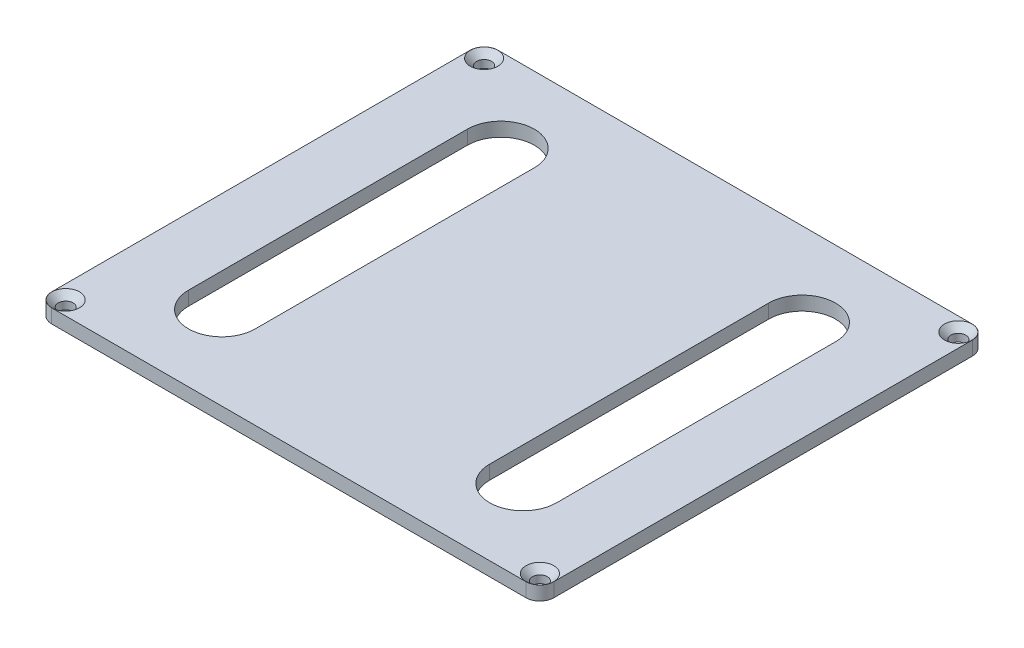
ISO-10303-21;
HEADER;
FILE_DESCRIPTION(('STEP AP214'),'2;1');
FILE_NAME('part.step','',(''),(''),'','','');
FILE_SCHEMA(('AUTOMOTIVE_DESIGN { 1 0 10303 214 1 1 1 1 }'));
ENDSEC;
DATA;
#1=APPLICATION_CONTEXT('core data for automotive mechanical design processes');
#2=APPLICATION_PROTOCOL_DEFINITION('international standard','automotive_design',2000,#1);
#3=PRODUCT_CONTEXT('',#1,'mechanical');
#4=PRODUCT('Part','Part','',(#3));
#5=PRODUCT_RELATED_PRODUCT_CATEGORY('part','',(#4));
#6=PRODUCT_DEFINITION_FORMATION('','',#4);
#7=PRODUCT_DEFINITION_CONTEXT('part definition',#1,'design');
#8=PRODUCT_DEFINITION('design','',#6,#7);
#9=PRODUCT_DEFINITION_SHAPE('','',#8);
#10=(LENGTH_UNIT() NAMED_UNIT(*) SI_UNIT(.MILLI.,.METRE.));
#11=(NAMED_UNIT(*) PLANE_ANGLE_UNIT() SI_UNIT($,.RADIAN.));
#12=(NAMED_UNIT(*) SI_UNIT($,.STERADIAN.) SOLID_ANGLE_UNIT());
#13=UNCERTAINTY_MEASURE_WITH_UNIT(LENGTH_MEASURE(1.E-05),#10,'distance_accuracy_value','');
#14=(GEOMETRIC_REPRESENTATION_CONTEXT(3) GLOBAL_UNCERTAINTY_ASSIGNED_CONTEXT((#13)) GLOBAL_UNIT_ASSIGNED_CONTEXT((#10,
#11,#12)) REPRESENTATION_CONTEXT('',''));
#15=CARTESIAN_POINT('',(0.,0.,0.));
#16=DIRECTION('',(0.,0.,1.));
#17=DIRECTION('',(1.,0.,0.));
#18=AXIS2_PLACEMENT_3D('',#15,#16,#17);
#19=CARTESIAN_POINT('',(-57.15,3.175,50.8));
#20=DIRECTION('',(1.,0.,0.));
#21=DIRECTION('',(0.,0.,-1.));
#22=AXIS2_PLACEMENT_3D('',#19,#20,#21);
#23=PLANE('',#22);
#24=DIRECTION('',(0.,0.,1.));
#25=VECTOR('',#24,1.);
#26=CARTESIAN_POINT('',(-57.15,0.,50.8));
#27=LINE('',#26,#25);
#28=CARTESIAN_POINT('',(-57.15,0.,-47.625));
#29=VERTEX_POINT('',#28);
#30=CARTESIAN_POINT('',(-57.15,0.,47.625));
#31=VERTEX_POINT('',#30);
#32=EDGE_CURVE('E258',#29,#31,#27,.T.);
#33=ORIENTED_EDGE('',*,*,#32,.T.);
#34=DIRECTION('',(0.,-1.,0.));
#35=VECTOR('',#34,1.);
#36=CARTESIAN_POINT('',(-57.15,3.175,47.625));
#37=LINE('',#36,#35);
#38=CARTESIAN_POINT('',(-57.15,3.175,47.625));
#39=VERTEX_POINT('',#38);
#40=EDGE_CURVE('E284',#31,#39,#37,.F.);
#41=ORIENTED_EDGE('',*,*,#40,.T.);
#42=DIRECTION('',(0.,0.,1.));
#43=VECTOR('',#42,1.);
#44=CARTESIAN_POINT('',(-57.15,3.175,50.8));
#45=LINE('',#44,#43);
#46=CARTESIAN_POINT('',(-57.15,3.175,-47.625));
#47=VERTEX_POINT('',#46);
#48=EDGE_CURVE('E244',#47,#39,#45,.T.);
#49=ORIENTED_EDGE('',*,*,#48,.F.);
#50=DIRECTION('',(0.,-1.,0.));
#51=VECTOR('',#50,1.);
#52=CARTESIAN_POINT('',(-57.15,3.175,-47.625));
#53=LINE('',#52,#51);
#54=EDGE_CURVE('E281',#47,#29,#53,.T.);
#55=ORIENTED_EDGE('',*,*,#54,.T.);
#56=EDGE_LOOP('',(#33,#41,#49,#55));
#57=FACE_BOUND('',#56,.T.);
#58=ADVANCED_FACE('F34',(#57),#23,.F.);
#59=CARTESIAN_POINT('',(57.15,3.175,50.8));
#60=DIRECTION('',(0.,0.,-1.));
#61=DIRECTION('',(-1.,0.,0.));
#62=AXIS2_PLACEMENT_3D('',#59,#60,#61);
#63=PLANE('',#62);
#64=DIRECTION('',(1.,0.,0.));
#65=VECTOR('',#64,1.);
#66=CARTESIAN_POINT('',(57.15,3.175,50.8));
#67=LINE('',#66,#65);
#68=CARTESIAN_POINT('',(-53.975,3.175,50.8));
#69=VERTEX_POINT('',#68);
#70=CARTESIAN_POINT('',(53.975,3.175,50.8));
#71=VERTEX_POINT('',#70);
#72=EDGE_CURVE('E247',#69,#71,#67,.T.);
#73=ORIENTED_EDGE('',*,*,#72,.F.);
#74=DIRECTION('',(0.,-1.,0.));
#75=VECTOR('',#74,1.);
#76=CARTESIAN_POINT('',(-53.975,3.175,50.8));
#77=LINE('',#76,#75);
#78=CARTESIAN_POINT('',(-53.975,0.,50.8));
#79=VERTEX_POINT('',#78);
#80=EDGE_CURVE('E270',#69,#79,#77,.T.);
#81=ORIENTED_EDGE('',*,*,#80,.T.);
#82=DIRECTION('',(1.,0.,0.));
#83=VECTOR('',#82,1.);
#84=CARTESIAN_POINT('',(57.15,0.,50.8));
#85=LINE('',#84,#83);
#86=CARTESIAN_POINT('',(53.975,0.,50.8));
#87=VERTEX_POINT('',#86);
#88=EDGE_CURVE('E261',#79,#87,#85,.T.);
#89=ORIENTED_EDGE('',*,*,#88,.T.);
#90=DIRECTION('',(0.,-1.,0.));
#91=VECTOR('',#90,1.);
#92=CARTESIAN_POINT('',(53.975,3.175,50.8));
#93=LINE('',#92,#91);
#94=EDGE_CURVE('E257',#87,#71,#93,.F.);
#95=ORIENTED_EDGE('',*,*,#94,.T.);
#96=EDGE_LOOP('',(#73,#81,#89,#95));
#97=FACE_BOUND('',#96,.T.);
#98=ADVANCED_FACE('F326',(#97),#63,.F.);
#99=CARTESIAN_POINT('',(57.15,3.175,50.8));
#100=DIRECTION('',(-1.,0.,0.));
#101=DIRECTION('',(0.,0.,1.));
#102=AXIS2_PLACEMENT_3D('',#99,#100,#101);
#103=PLANE('',#102);
#104=DIRECTION('',(0.,0.,-1.));
#105=VECTOR('',#104,1.);
#106=CARTESIAN_POINT('',(57.15,0.,50.8));
#107=LINE('',#106,#105);
#108=CARTESIAN_POINT('',(57.15,0.,47.625));
#109=VERTEX_POINT('',#108);
#110=CARTESIAN_POINT('',(57.15,0.,-47.625));
#111=VERTEX_POINT('',#110);
#112=EDGE_CURVE('E264',#109,#111,#107,.T.);
#113=ORIENTED_EDGE('',*,*,#112,.T.);
#114=DIRECTION('',(0.,-1.,0.));
#115=VECTOR('',#114,1.);
#116=CARTESIAN_POINT('',(57.15,3.175,-47.625));
#117=LINE('',#116,#115);
#118=CARTESIAN_POINT('',(57.15,3.175,-47.625));
#119=VERTEX_POINT('',#118);
#120=EDGE_CURVE('E11',#111,#119,#117,.F.);
#121=ORIENTED_EDGE('',*,*,#120,.T.);
#122=DIRECTION('',(0.,0.,-1.));
#123=VECTOR('',#122,1.);
#124=CARTESIAN_POINT('',(57.15,3.175,50.8));
#125=LINE('',#124,#123);
#126=CARTESIAN_POINT('',(57.15,3.175,47.625));
#127=VERTEX_POINT('',#126);
#128=EDGE_CURVE('E251',#127,#119,#125,.T.);
#129=ORIENTED_EDGE('',*,*,#128,.F.);
#130=DIRECTION('',(0.,-1.,0.));
#131=VECTOR('',#130,1.);
#132=CARTESIAN_POINT('',(57.15,3.175,47.625));
#133=LINE('',#132,#131);
#134=EDGE_CURVE('E43',#127,#109,#133,.T.);
#135=ORIENTED_EDGE('',*,*,#134,.T.);
#136=EDGE_LOOP('',(#113,#121,#129,#135));
#137=FACE_BOUND('',#136,.T.);
#138=ADVANCED_FACE('F332',(#137),#103,.F.);
#139=CARTESIAN_POINT('',(57.15,3.175,-50.8));
#140=DIRECTION('',(0.,0.,1.));
#141=DIRECTION('',(1.,0.,0.));
#142=AXIS2_PLACEMENT_3D('',#139,#140,#141);
#143=PLANE('',#142);
#144=DIRECTION('',(-1.,0.,0.));
#145=VECTOR('',#144,1.);
#146=CARTESIAN_POINT('',(57.15,0.,-50.8));
#147=LINE('',#146,#145);
#148=CARTESIAN_POINT('',(53.975,0.,-50.8));
#149=VERTEX_POINT('',#148);
#150=CARTESIAN_POINT('',(-53.975,0.,-50.8));
#151=VERTEX_POINT('',#150);
#152=EDGE_CURVE('E248',#149,#151,#147,.T.);
#153=ORIENTED_EDGE('',*,*,#152,.T.);
#154=DIRECTION('',(0.,-1.,0.));
#155=VECTOR('',#154,1.);
#156=CARTESIAN_POINT('',(-53.975,3.175,-50.8));
#157=LINE('',#156,#155);
#158=CARTESIAN_POINT('',(-53.975,3.175,-50.8));
#159=VERTEX_POINT('',#158);
#160=EDGE_CURVE('E297',#151,#159,#157,.F.);
#161=ORIENTED_EDGE('',*,*,#160,.T.);
#162=DIRECTION('',(-1.,0.,0.));
#163=VECTOR('',#162,1.);
#164=CARTESIAN_POINT('',(57.15,3.175,-50.8));
#165=LINE('',#164,#163);
#166=CARTESIAN_POINT('',(53.975,3.175,-50.8));
#167=VERTEX_POINT('',#166);
#168=EDGE_CURVE('E254',#167,#159,#165,.T.);
#169=ORIENTED_EDGE('',*,*,#168,.F.);
#170=DIRECTION('',(0.,-1.,0.));
#171=VECTOR('',#170,1.);
#172=CARTESIAN_POINT('',(53.975,3.175,-50.8));
#173=LINE('',#172,#171);
#174=EDGE_CURVE('E294',#167,#149,#173,.T.);
#175=ORIENTED_EDGE('',*,*,#174,.T.);
#176=EDGE_LOOP('',(#153,#161,#169,#175));
#177=FACE_BOUND('',#176,.T.);
#178=ADVANCED_FACE('F361',(#177),#143,.F.);
#179=CARTESIAN_POINT('',(0.,3.175,0.));
#180=DIRECTION('',(0.,1.,0.));
#181=DIRECTION('',(0.,0.,1.));
#182=AXIS2_PLACEMENT_3D('',#179,#180,#181);
#183=PLANE('',#182);
#184=CARTESIAN_POINT('',(-34.29,3.175,31.75));
#185=DIRECTION('',(0.,1.,0.));
#186=DIRECTION('',(0.,0.,1.));
#187=AXIS2_PLACEMENT_3D('',#184,#185,#186);
#188=CIRCLE('',#187,7.62);
#189=CARTESIAN_POINT('',(-41.91,3.175,31.75));
#190=VERTEX_POINT('',#189);
#191=CARTESIAN_POINT('',(-26.67,3.175,31.75));
#192=VERTEX_POINT('',#191);
#193=EDGE_CURVE('E51',#190,#192,#188,.T.);
#194=ORIENTED_EDGE('',*,*,#193,.F.);
#195=DIRECTION('',(0.,0.,1.));
#196=VECTOR('',#195,1.);
#197=CARTESIAN_POINT('',(-41.91,3.175,31.75));
#198=LINE('',#197,#196);
#199=CARTESIAN_POINT('',(-41.91,3.175,-31.75));
#200=VERTEX_POINT('',#199);
#201=EDGE_CURVE('E169',#200,#190,#198,.T.);
#202=ORIENTED_EDGE('',*,*,#201,.F.);
#203=CARTESIAN_POINT('',(-34.29,3.175,-31.75));
#204=DIRECTION('',(0.,1.,0.));
#205=DIRECTION('',(0.,0.,1.));
#206=AXIS2_PLACEMENT_3D('',#203,#204,#205);
#207=CIRCLE('',#206,7.62);
#208=CARTESIAN_POINT('',(-26.67,3.175,-31.75));
#209=VERTEX_POINT('',#208);
#210=EDGE_CURVE('E172',#209,#200,#207,.T.);
#211=ORIENTED_EDGE('',*,*,#210,.F.);
#212=DIRECTION('',(0.,0.,-1.));
#213=VECTOR('',#212,1.);
#214=CARTESIAN_POINT('',(-26.67,3.175,31.75));
#215=LINE('',#214,#213);
#216=EDGE_CURVE('E178',#192,#209,#215,.T.);
#217=ORIENTED_EDGE('',*,*,#216,.F.);
#218=EDGE_LOOP('',(#194,#202,#211,#217));
#219=FACE_BOUND('',#218,.T.);
#220=CARTESIAN_POINT('',(34.29,3.175,31.75));
#221=DIRECTION('',(0.,1.,0.));
#222=DIRECTION('',(0.,0.,-1.));
#223=AXIS2_PLACEMENT_3D('',#220,#221,#222);
#224=CIRCLE('',#223,7.62);
#225=CARTESIAN_POINT('',(26.67,3.175,31.75));
#226=VERTEX_POINT('',#225);
#227=CARTESIAN_POINT('',(41.91,3.175,31.75));
#228=VERTEX_POINT('',#227);
#229=EDGE_CURVE('E59',#226,#228,#224,.T.);
#230=ORIENTED_EDGE('',*,*,#229,.F.);
#231=DIRECTION('',(0.,0.,1.));
#232=VECTOR('',#231,1.);
#233=CARTESIAN_POINT('',(26.67,3.175,31.75));
#234=LINE('',#233,#232);
#235=CARTESIAN_POINT('',(26.67,3.175,-31.75));
#236=VERTEX_POINT('',#235);
#237=EDGE_CURVE('E193',#236,#226,#234,.T.);
#238=ORIENTED_EDGE('',*,*,#237,.F.);
#239=CARTESIAN_POINT('',(34.29,3.175,-31.75));
#240=DIRECTION('',(0.,1.,0.));
#241=DIRECTION('',(0.,0.,-1.));
#242=AXIS2_PLACEMENT_3D('',#239,#240,#241);
#243=CIRCLE('',#242,7.62);
#244=CARTESIAN_POINT('',(41.91,3.175,-31.75));
#245=VERTEX_POINT('',#244);
#246=EDGE_CURVE('E207',#245,#236,#243,.T.);
#247=ORIENTED_EDGE('',*,*,#246,.F.);
#248=DIRECTION('',(0.,0.,-1.));
#249=VECTOR('',#248,1.);
#250=CARTESIAN_POINT('',(41.91,3.175,31.75));
#251=LINE('',#250,#249);
#252=EDGE_CURVE('E204',#228,#245,#251,.T.);
#253=ORIENTED_EDGE('',*,*,#252,.F.);
#254=EDGE_LOOP('',(#230,#238,#247,#253));
#255=FACE_BOUND('',#254,.T.);
#256=CARTESIAN_POINT('',(53.975,3.175,47.625));
#257=DIRECTION('',(0.,1.,0.));
#258=DIRECTION('',(0.,0.,1.));
#259=AXIS2_PLACEMENT_3D('',#256,#257,#258);
#260=CIRCLE('',#259,3.15);
#261=CARTESIAN_POINT('',(53.975,3.175,50.775));
#262=VERTEX_POINT('',#261);
#263=EDGE_CURVE('E185',#262,#262,#260,.T.);
#264=ORIENTED_EDGE('',*,*,#263,.F.);
#265=EDGE_LOOP('',(#264));
#266=FACE_BOUND('',#265,.T.);
#267=CARTESIAN_POINT('',(53.975,3.175,-47.625));
#268=DIRECTION('',(0.,1.,0.));
#269=DIRECTION('',(0.,0.,1.));
#270=AXIS2_PLACEMENT_3D('',#267,#268,#269);
#271=CIRCLE('',#270,3.15);
#272=CARTESIAN_POINT('',(53.975,3.175,-44.475));
#273=VERTEX_POINT('',#272);
#274=EDGE_CURVE('E223',#273,#273,#271,.T.);
#275=ORIENTED_EDGE('',*,*,#274,.F.);
#276=EDGE_LOOP('',(#275));
#277=FACE_BOUND('',#276,.T.);
#278=CARTESIAN_POINT('',(-53.975,3.175,-47.625));
#279=DIRECTION('',(0.,1.,0.));
#280=DIRECTION('',(0.,0.,1.));
#281=AXIS2_PLACEMENT_3D('',#278,#279,#280);
#282=CIRCLE('',#281,3.15);
#283=CARTESIAN_POINT('',(-53.975,3.175,-44.475));
#284=VERTEX_POINT('',#283);
#285=EDGE_CURVE('E230',#284,#284,#282,.T.);
#286=ORIENTED_EDGE('',*,*,#285,.F.);
#287=EDGE_LOOP('',(#286));
#288=FACE_BOUND('',#287,.T.);
#289=CARTESIAN_POINT('',(-53.975,3.175,47.625));
#290=DIRECTION('',(0.,1.,0.));
#291=DIRECTION('',(0.,0.,1.));
#292=AXIS2_PLACEMENT_3D('',#289,#290,#291);
#293=CIRCLE('',#292,3.15);
#294=CARTESIAN_POINT('',(-53.975,3.175,50.775));
#295=VERTEX_POINT('',#294);
#296=EDGE_CURVE('E237',#295,#295,#293,.T.);
#297=ORIENTED_EDGE('',*,*,#296,.F.);
#298=EDGE_LOOP('',(#297));
#299=FACE_BOUND('',#298,.T.);
#300=ORIENTED_EDGE('',*,*,#48,.T.);
#301=CARTESIAN_POINT('',(-53.975,3.175,47.625));
#302=DIRECTION('',(0.,1.,0.));
#303=DIRECTION('',(0.,0.,1.));
#304=AXIS2_PLACEMENT_3D('',#301,#302,#303);
#305=CIRCLE('',#304,3.175);
#306=EDGE_CURVE('E292',#39,#69,#305,.T.);
#307=ORIENTED_EDGE('',*,*,#306,.T.);
#308=ORIENTED_EDGE('',*,*,#72,.T.);
#309=CARTESIAN_POINT('',(53.975,3.175,47.625));
#310=DIRECTION('',(0.,1.,0.));
#311=DIRECTION('',(0.,0.,1.));
#312=AXIS2_PLACEMENT_3D('',#309,#310,#311);
#313=CIRCLE('',#312,3.175);
#314=EDGE_CURVE('E286',#71,#127,#313,.T.);
#315=ORIENTED_EDGE('',*,*,#314,.T.);
#316=ORIENTED_EDGE('',*,*,#128,.T.);
#317=CARTESIAN_POINT('',(53.975,3.175,-47.625));
#318=DIRECTION('',(0.,1.,0.));
#319=DIRECTION('',(0.,0.,1.));
#320=AXIS2_PLACEMENT_3D('',#317,#318,#319);
#321=CIRCLE('',#320,3.175);
#322=EDGE_CURVE('E288',#119,#167,#321,.T.);
#323=ORIENTED_EDGE('',*,*,#322,.T.);
#324=ORIENTED_EDGE('',*,*,#168,.T.);
#325=CARTESIAN_POINT('',(-53.975,3.175,-47.625));
#326=DIRECTION('',(0.,1.,0.));
#327=DIRECTION('',(0.,0.,1.));
#328=AXIS2_PLACEMENT_3D('',#325,#326,#327);
#329=CIRCLE('',#328,3.175);
#330=EDGE_CURVE('E290',#159,#47,#329,.T.);
#331=ORIENTED_EDGE('',*,*,#330,.T.);
#332=EDGE_LOOP('',(#300,#307,#308,#315,#316,#323,#324,#331));
#333=FACE_BOUND('',#332,.T.);
#334=ADVANCED_FACE('F357',(#219,#255,#266,#277,#288,#299,#333),#183,.T.);
#335=CARTESIAN_POINT('',(0.,0.,0.));
#336=DIRECTION('',(0.,1.,0.));
#337=DIRECTION('',(0.,0.,1.));
#338=AXIS2_PLACEMENT_3D('',#335,#336,#337);
#339=PLANE('',#338);
#340=DIRECTION('',(0.,0.,1.));
#341=VECTOR('',#340,1.);
#342=CARTESIAN_POINT('',(-41.91,0.,31.75));
#343=LINE('',#342,#341);
#344=CARTESIAN_POINT('',(-41.91,0.,-31.75));
#345=VERTEX_POINT('',#344);
#346=CARTESIAN_POINT('',(-41.91,0.,31.75));
#347=VERTEX_POINT('',#346);
#348=EDGE_CURVE('E156',#345,#347,#343,.T.);
#349=ORIENTED_EDGE('',*,*,#348,.T.);
#350=CARTESIAN_POINT('',(-34.29,0.,31.75));
#351=DIRECTION('',(0.,1.,0.));
#352=DIRECTION('',(0.,0.,1.));
#353=AXIS2_PLACEMENT_3D('',#350,#351,#352);
#354=CIRCLE('',#353,7.62);
#355=CARTESIAN_POINT('',(-26.67,0.,31.75));
#356=VERTEX_POINT('',#355);
#357=EDGE_CURVE('E150',#347,#356,#354,.T.);
#358=ORIENTED_EDGE('',*,*,#357,.T.);
#359=DIRECTION('',(0.,0.,-1.));
#360=VECTOR('',#359,1.);
#361=CARTESIAN_POINT('',(-26.67,0.,31.75));
#362=LINE('',#361,#360);
#363=CARTESIAN_POINT('',(-26.67,0.,-31.75));
#364=VERTEX_POINT('',#363);
#365=EDGE_CURVE('E160',#356,#364,#362,.T.);
#366=ORIENTED_EDGE('',*,*,#365,.T.);
#367=CARTESIAN_POINT('',(-34.29,0.,-31.75));
#368=DIRECTION('',(0.,1.,0.));
#369=DIRECTION('',(0.,0.,1.));
#370=AXIS2_PLACEMENT_3D('',#367,#368,#369);
#371=CIRCLE('',#370,7.62);
#372=EDGE_CURVE('E164',#364,#345,#371,.T.);
#373=ORIENTED_EDGE('',*,*,#372,.T.);
#374=EDGE_LOOP('',(#349,#358,#366,#373));
#375=FACE_BOUND('',#374,.T.);
#376=DIRECTION('',(0.,0.,1.));
#377=VECTOR('',#376,1.);
#378=CARTESIAN_POINT('',(26.67,0.,31.75));
#379=LINE('',#378,#377);
#380=CARTESIAN_POINT('',(26.67,0.,-31.75));
#381=VERTEX_POINT('',#380);
#382=CARTESIAN_POINT('',(26.67,0.,31.75));
#383=VERTEX_POINT('',#382);
#384=EDGE_CURVE('E199',#381,#383,#379,.T.);
#385=ORIENTED_EDGE('',*,*,#384,.T.);
#386=CARTESIAN_POINT('',(34.29,0.,31.75));
#387=DIRECTION('',(0.,1.,0.));
#388=DIRECTION('',(0.,0.,-1.));
#389=AXIS2_PLACEMENT_3D('',#386,#387,#388);
#390=CIRCLE('',#389,7.62);
#391=CARTESIAN_POINT('',(41.91,0.,31.75));
#392=VERTEX_POINT('',#391);
#393=EDGE_CURVE('E189',#383,#392,#390,.T.);
#394=ORIENTED_EDGE('',*,*,#393,.T.);
#395=DIRECTION('',(0.,0.,-1.));
#396=VECTOR('',#395,1.);
#397=CARTESIAN_POINT('',(41.91,0.,31.75));
#398=LINE('',#397,#396);
#399=CARTESIAN_POINT('',(41.91,0.,-31.75));
#400=VERTEX_POINT('',#399);
#401=EDGE_CURVE('E192',#392,#400,#398,.T.);
#402=ORIENTED_EDGE('',*,*,#401,.T.);
#403=CARTESIAN_POINT('',(34.29,0.,-31.75));
#404=DIRECTION('',(0.,1.,0.));
#405=DIRECTION('',(0.,0.,-1.));
#406=AXIS2_PLACEMENT_3D('',#403,#404,#405);
#407=CIRCLE('',#406,7.62);
#408=EDGE_CURVE('E196',#400,#381,#407,.T.);
#409=ORIENTED_EDGE('',*,*,#408,.T.);
#410=EDGE_LOOP('',(#385,#394,#402,#409));
#411=FACE_BOUND('',#410,.T.);
#412=CARTESIAN_POINT('',(53.975,0.,47.625));
#413=DIRECTION('',(0.,1.,0.));
#414=DIRECTION('',(0.,0.,1.));
#415=AXIS2_PLACEMENT_3D('',#412,#413,#414);
#416=CIRCLE('',#415,1.7);
#417=CARTESIAN_POINT('',(53.975,0.,49.325));
#418=VERTEX_POINT('',#417);
#419=EDGE_CURVE('E38',#418,#418,#416,.T.);
#420=ORIENTED_EDGE('',*,*,#419,.T.);
#421=EDGE_LOOP('',(#420));
#422=FACE_BOUND('',#421,.T.);
#423=CARTESIAN_POINT('',(53.975,0.,-47.625));
#424=DIRECTION('',(0.,1.,0.));
#425=DIRECTION('',(0.,0.,1.));
#426=AXIS2_PLACEMENT_3D('',#423,#424,#425);
#427=CIRCLE('',#426,1.7);
#428=CARTESIAN_POINT('',(53.975,0.,-45.925));
#429=VERTEX_POINT('',#428);
#430=EDGE_CURVE('E229',#429,#429,#427,.T.);
#431=ORIENTED_EDGE('',*,*,#430,.T.);
#432=EDGE_LOOP('',(#431));
#433=FACE_BOUND('',#432,.T.);
#434=CARTESIAN_POINT('',(-53.975,0.,-47.625));
#435=DIRECTION('',(0.,1.,0.));
#436=DIRECTION('',(0.,0.,1.));
#437=AXIS2_PLACEMENT_3D('',#434,#435,#436);
#438=CIRCLE('',#437,1.7);
#439=CARTESIAN_POINT('',(-53.975,0.,-45.925));
#440=VERTEX_POINT('',#439);
#441=EDGE_CURVE('E236',#440,#440,#438,.T.);
#442=ORIENTED_EDGE('',*,*,#441,.T.);
#443=EDGE_LOOP('',(#442));
#444=FACE_BOUND('',#443,.T.);
#445=CARTESIAN_POINT('',(-53.975,0.,47.625));
#446=DIRECTION('',(0.,1.,0.));
#447=DIRECTION('',(0.,0.,1.));
#448=AXIS2_PLACEMENT_3D('',#445,#446,#447);
#449=CIRCLE('',#448,1.7);
#450=CARTESIAN_POINT('',(-53.975,0.,49.325));
#451=VERTEX_POINT('',#450);
#452=EDGE_CURVE('E243',#451,#451,#449,.T.);
#453=ORIENTED_EDGE('',*,*,#452,.T.);
#454=EDGE_LOOP('',(#453));
#455=FACE_BOUND('',#454,.T.);
#456=ORIENTED_EDGE('',*,*,#88,.F.);
#457=CARTESIAN_POINT('',(-53.975,0.,47.625));
#458=DIRECTION('',(0.,1.,0.));
#459=DIRECTION('',(0.,0.,1.));
#460=AXIS2_PLACEMENT_3D('',#457,#458,#459);
#461=CIRCLE('',#460,3.175);
#462=EDGE_CURVE('E279',#79,#31,#461,.F.);
#463=ORIENTED_EDGE('',*,*,#462,.T.);
#464=ORIENTED_EDGE('',*,*,#32,.F.);
#465=CARTESIAN_POINT('',(-53.975,0.,-47.625));
#466=DIRECTION('',(0.,1.,0.));
#467=DIRECTION('',(0.,0.,1.));
#468=AXIS2_PLACEMENT_3D('',#465,#466,#467);
#469=CIRCLE('',#468,3.175);
#470=EDGE_CURVE('E277',#29,#151,#469,.F.);
#471=ORIENTED_EDGE('',*,*,#470,.T.);
#472=ORIENTED_EDGE('',*,*,#152,.F.);
#473=CARTESIAN_POINT('',(53.975,0.,-47.625));
#474=DIRECTION('',(0.,1.,0.));
#475=DIRECTION('',(0.,0.,1.));
#476=AXIS2_PLACEMENT_3D('',#473,#474,#475);
#477=CIRCLE('',#476,3.175);
#478=EDGE_CURVE('E275',#149,#111,#477,.F.);
#479=ORIENTED_EDGE('',*,*,#478,.T.);
#480=ORIENTED_EDGE('',*,*,#112,.F.);
#481=CARTESIAN_POINT('',(53.975,0.,47.625));
#482=DIRECTION('',(0.,1.,0.));
#483=DIRECTION('',(0.,0.,1.));
#484=AXIS2_PLACEMENT_3D('',#481,#482,#483);
#485=CIRCLE('',#484,3.175);
#486=EDGE_CURVE('E273',#109,#87,#485,.F.);
#487=ORIENTED_EDGE('',*,*,#486,.T.);
#488=EDGE_LOOP('',(#456,#463,#464,#471,#472,#479,#480,#487));
#489=FACE_BOUND('',#488,.T.);
#490=ADVANCED_FACE('F166',(#375,#411,#422,#433,#444,#455,#489),#339,.F.);
#491=CARTESIAN_POINT('',(-53.975,3.175,47.625));
#492=DIRECTION('',(0.,-1.,0.));
#493=DIRECTION('',(0.,0.,-1.));
#494=AXIS2_PLACEMENT_3D('',#491,#492,#493);
#495=CYLINDRICAL_SURFACE('',#494,3.175);
#496=ORIENTED_EDGE('',*,*,#306,.F.);
#497=ORIENTED_EDGE('',*,*,#40,.F.);
#498=ORIENTED_EDGE('',*,*,#462,.F.);
#499=ORIENTED_EDGE('',*,*,#80,.F.);
#500=EDGE_LOOP('',(#496,#497,#498,#499));
#501=FACE_BOUND('',#500,.T.);
#502=ADVANCED_FACE('F337',(#501),#495,.T.);
#503=CARTESIAN_POINT('',(-53.975,3.175,-47.625));
#504=DIRECTION('',(0.,-1.,0.));
#505=DIRECTION('',(0.,0.,-1.));
#506=AXIS2_PLACEMENT_3D('',#503,#504,#505);
#507=CYLINDRICAL_SURFACE('',#506,3.175);
#508=ORIENTED_EDGE('',*,*,#330,.F.);
#509=ORIENTED_EDGE('',*,*,#160,.F.);
#510=ORIENTED_EDGE('',*,*,#470,.F.);
#511=ORIENTED_EDGE('',*,*,#54,.F.);
#512=EDGE_LOOP('',(#508,#509,#510,#511));
#513=FACE_BOUND('',#512,.T.);
#514=ADVANCED_FACE('F340',(#513),#507,.T.);
#515=CARTESIAN_POINT('',(53.975,3.175,-47.625));
#516=DIRECTION('',(0.,-1.,0.));
#517=DIRECTION('',(0.,0.,-1.));
#518=AXIS2_PLACEMENT_3D('',#515,#516,#517);
#519=CYLINDRICAL_SURFACE('',#518,3.175);
#520=ORIENTED_EDGE('',*,*,#322,.F.);
#521=ORIENTED_EDGE('',*,*,#120,.F.);
#522=ORIENTED_EDGE('',*,*,#478,.F.);
#523=ORIENTED_EDGE('',*,*,#174,.F.);
#524=EDGE_LOOP('',(#520,#521,#522,#523));
#525=FACE_BOUND('',#524,.T.);
#526=ADVANCED_FACE('F343',(#525),#519,.T.);
#527=CARTESIAN_POINT('',(53.975,3.175,47.625));
#528=DIRECTION('',(0.,-1.,0.));
#529=DIRECTION('',(0.,0.,-1.));
#530=AXIS2_PLACEMENT_3D('',#527,#528,#529);
#531=CYLINDRICAL_SURFACE('',#530,3.175);
#532=ORIENTED_EDGE('',*,*,#314,.F.);
#533=ORIENTED_EDGE('',*,*,#94,.F.);
#534=ORIENTED_EDGE('',*,*,#486,.F.);
#535=ORIENTED_EDGE('',*,*,#134,.F.);
#536=EDGE_LOOP('',(#532,#533,#534,#535));
#537=FACE_BOUND('',#536,.T.);
#538=ADVANCED_FACE('F36',(#537),#531,.T.);
#539=CARTESIAN_POINT('',(-53.975,3.175,47.625));
#540=DIRECTION('',(0.,1.,0.));
#541=DIRECTION('',(0.,0.,1.));
#542=AXIS2_PLACEMENT_3D('',#539,#540,#541);
#543=CYLINDRICAL_SURFACE('',#542,1.7);
#544=CARTESIAN_POINT('',(-53.975,1.725,47.625));
#545=DIRECTION('',(0.,1.,0.));
#546=DIRECTION('',(0.,0.,1.));
#547=AXIS2_PLACEMENT_3D('',#544,#545,#546);
#548=CIRCLE('',#547,1.7);
#549=CARTESIAN_POINT('',(-53.975,1.725,49.325));
#550=VERTEX_POINT('',#549);
#551=EDGE_CURVE('E240',#550,#550,#548,.T.);
#552=ORIENTED_EDGE('',*,*,#551,.T.);
#553=EDGE_LOOP('',(#552));
#554=FACE_BOUND('',#553,.T.);
#555=ORIENTED_EDGE('',*,*,#452,.F.);
#556=EDGE_LOOP('',(#555));
#557=FACE_BOUND('',#556,.T.);
#558=ADVANCED_FACE('F350',(#554,#557),#543,.F.);
#559=CARTESIAN_POINT('',(-53.975,3.175,47.625));
#560=DIRECTION('',(0.,1.,0.));
#561=DIRECTION('',(0.,0.,1.));
#562=AXIS2_PLACEMENT_3D('',#559,#560,#561);
#563=CONICAL_SURFACE('',#562,3.15,0.785398163397447);
#564=ORIENTED_EDGE('',*,*,#551,.F.);
#565=EDGE_LOOP('',(#564));
#566=FACE_BOUND('',#565,.T.);
#567=ORIENTED_EDGE('',*,*,#296,.T.);
#568=EDGE_LOOP('',(#567));
#569=FACE_BOUND('',#568,.T.);
#570=ADVANCED_FACE('F513',(#566,#569),#563,.F.);
#571=CARTESIAN_POINT('',(-53.975,3.175,-47.625));
#572=DIRECTION('',(0.,1.,0.));
#573=DIRECTION('',(0.,0.,1.));
#574=AXIS2_PLACEMENT_3D('',#571,#572,#573);
#575=CYLINDRICAL_SURFACE('',#574,1.7);
#576=CARTESIAN_POINT('',(-53.975,1.725,-47.625));
#577=DIRECTION('',(0.,1.,0.));
#578=DIRECTION('',(0.,0.,1.));
#579=AXIS2_PLACEMENT_3D('',#576,#577,#578);
#580=CIRCLE('',#579,1.7);
#581=CARTESIAN_POINT('',(-53.975,1.725,-45.925));
#582=VERTEX_POINT('',#581);
#583=EDGE_CURVE('E233',#582,#582,#580,.T.);
#584=ORIENTED_EDGE('',*,*,#583,.T.);
#585=EDGE_LOOP('',(#584));
#586=FACE_BOUND('',#585,.T.);
#587=ORIENTED_EDGE('',*,*,#441,.F.);
#588=EDGE_LOOP('',(#587));
#589=FACE_BOUND('',#588,.T.);
#590=ADVANCED_FACE('F322',(#586,#589),#575,.F.);
#591=CARTESIAN_POINT('',(-53.975,3.175,-47.625));
#592=DIRECTION('',(0.,1.,0.));
#593=DIRECTION('',(0.,0.,1.));
#594=AXIS2_PLACEMENT_3D('',#591,#592,#593);
#595=CONICAL_SURFACE('',#594,3.15,0.785398163397447);
#596=ORIENTED_EDGE('',*,*,#583,.F.);
#597=EDGE_LOOP('',(#596));
#598=FACE_BOUND('',#597,.T.);
#599=ORIENTED_EDGE('',*,*,#285,.T.);
#600=EDGE_LOOP('',(#599));
#601=FACE_BOUND('',#600,.T.);
#602=ADVANCED_FACE('F312',(#598,#601),#595,.F.);
#603=CARTESIAN_POINT('',(53.975,3.175,-47.625));
#604=DIRECTION('',(0.,1.,0.));
#605=DIRECTION('',(0.,0.,1.));
#606=AXIS2_PLACEMENT_3D('',#603,#604,#605);
#607=CYLINDRICAL_SURFACE('',#606,1.7);
#608=CARTESIAN_POINT('',(53.975,1.725,-47.625));
#609=DIRECTION('',(0.,1.,0.));
#610=DIRECTION('',(0.,0.,1.));
#611=AXIS2_PLACEMENT_3D('',#608,#609,#610);
#612=CIRCLE('',#611,1.7);
#613=CARTESIAN_POINT('',(53.975,1.725,-45.925));
#614=VERTEX_POINT('',#613);
#615=EDGE_CURVE('E226',#614,#614,#612,.T.);
#616=ORIENTED_EDGE('',*,*,#615,.T.);
#617=EDGE_LOOP('',(#616));
#618=FACE_BOUND('',#617,.T.);
#619=ORIENTED_EDGE('',*,*,#430,.F.);
#620=EDGE_LOOP('',(#619));
#621=FACE_BOUND('',#620,.T.);
#622=ADVANCED_FACE('F309',(#618,#621),#607,.F.);
#623=CARTESIAN_POINT('',(53.975,3.175,-47.625));
#624=DIRECTION('',(0.,1.,0.));
#625=DIRECTION('',(0.,0.,1.));
#626=AXIS2_PLACEMENT_3D('',#623,#624,#625);
#627=CONICAL_SURFACE('',#626,3.15,0.785398163397447);
#628=ORIENTED_EDGE('',*,*,#615,.F.);
#629=EDGE_LOOP('',(#628));
#630=FACE_BOUND('',#629,.T.);
#631=ORIENTED_EDGE('',*,*,#274,.T.);
#632=EDGE_LOOP('',(#631));
#633=FACE_BOUND('',#632,.T.);
#634=ADVANCED_FACE('F311',(#630,#633),#627,.F.);
#635=CARTESIAN_POINT('',(53.975,3.175,47.625));
#636=DIRECTION('',(0.,1.,0.));
#637=DIRECTION('',(0.,0.,1.));
#638=AXIS2_PLACEMENT_3D('',#635,#636,#637);
#639=CYLINDRICAL_SURFACE('',#638,1.7);
#640=CARTESIAN_POINT('',(53.975,1.725,47.625));
#641=DIRECTION('',(0.,1.,0.));
#642=DIRECTION('',(0.,0.,1.));
#643=AXIS2_PLACEMENT_3D('',#640,#641,#642);
#644=CIRCLE('',#643,1.7);
#645=CARTESIAN_POINT('',(53.975,1.725,49.325));
#646=VERTEX_POINT('',#645);
#647=EDGE_CURVE('E220',#646,#646,#644,.T.);
#648=ORIENTED_EDGE('',*,*,#647,.T.);
#649=EDGE_LOOP('',(#648));
#650=FACE_BOUND('',#649,.T.);
#651=ORIENTED_EDGE('',*,*,#419,.F.);
#652=EDGE_LOOP('',(#651));
#653=FACE_BOUND('',#652,.T.);
#654=ADVANCED_FACE('F319',(#650,#653),#639,.F.);
#655=CARTESIAN_POINT('',(53.975,3.175,47.625));
#656=DIRECTION('',(0.,1.,0.));
#657=DIRECTION('',(0.,0.,1.));
#658=AXIS2_PLACEMENT_3D('',#655,#656,#657);
#659=CONICAL_SURFACE('',#658,3.15,0.785398163397447);
#660=ORIENTED_EDGE('',*,*,#647,.F.);
#661=EDGE_LOOP('',(#660));
#662=FACE_BOUND('',#661,.T.);
#663=ORIENTED_EDGE('',*,*,#263,.T.);
#664=EDGE_LOOP('',(#663));
#665=FACE_BOUND('',#664,.T.);
#666=ADVANCED_FACE('F408',(#662,#665),#659,.F.);
#667=CARTESIAN_POINT('',(34.29,0.,31.75));
#668=DIRECTION('',(0.,1.,0.));
#669=DIRECTION('',(0.,0.,1.));
#670=AXIS2_PLACEMENT_3D('',#667,#668,#669);
#671=CYLINDRICAL_SURFACE('',#670,7.62);
#672=ORIENTED_EDGE('',*,*,#229,.T.);
#673=DIRECTION('',(0.,1.,0.));
#674=VECTOR('',#673,1.);
#675=CARTESIAN_POINT('',(41.91,0.,31.75));
#676=LINE('',#675,#674);
#677=EDGE_CURVE('E202',#392,#228,#676,.T.);
#678=ORIENTED_EDGE('',*,*,#677,.F.);
#679=ORIENTED_EDGE('',*,*,#393,.F.);
#680=DIRECTION('',(0.,1.,0.));
#681=VECTOR('',#680,1.);
#682=CARTESIAN_POINT('',(26.67,0.,31.75));
#683=LINE('',#682,#681);
#684=EDGE_CURVE('E179',#383,#226,#683,.T.);
#685=ORIENTED_EDGE('',*,*,#684,.T.);
#686=EDGE_LOOP('',(#672,#678,#679,#685));
#687=FACE_BOUND('',#686,.T.);
#688=ADVANCED_FACE('F418',(#687),#671,.F.);
#689=CARTESIAN_POINT('',(26.67,0.,31.75));
#690=DIRECTION('',(-1.,0.,0.));
#691=DIRECTION('',(0.,0.,1.));
#692=AXIS2_PLACEMENT_3D('',#689,#690,#691);
#693=PLANE('',#692);
#694=ORIENTED_EDGE('',*,*,#237,.T.);
#695=ORIENTED_EDGE('',*,*,#684,.F.);
#696=ORIENTED_EDGE('',*,*,#384,.F.);
#697=DIRECTION('',(0.,1.,0.));
#698=VECTOR('',#697,1.);
#699=CARTESIAN_POINT('',(26.67,0.,-31.75));
#700=LINE('',#699,#698);
#701=EDGE_CURVE('E213',#381,#236,#700,.T.);
#702=ORIENTED_EDGE('',*,*,#701,.T.);
#703=EDGE_LOOP('',(#694,#695,#696,#702));
#704=FACE_BOUND('',#703,.T.);
#705=ADVANCED_FACE('F423',(#704),#693,.F.);
#706=CARTESIAN_POINT('',(34.29,0.,-31.75));
#707=DIRECTION('',(0.,1.,0.));
#708=DIRECTION('',(0.,0.,1.));
#709=AXIS2_PLACEMENT_3D('',#706,#707,#708);
#710=CYLINDRICAL_SURFACE('',#709,7.62);
#711=ORIENTED_EDGE('',*,*,#246,.T.);
#712=ORIENTED_EDGE('',*,*,#701,.F.);
#713=ORIENTED_EDGE('',*,*,#408,.F.);
#714=DIRECTION('',(0.,1.,0.));
#715=VECTOR('',#714,1.);
#716=CARTESIAN_POINT('',(41.91,0.,-31.75));
#717=LINE('',#716,#715);
#718=EDGE_CURVE('E215',#400,#245,#717,.T.);
#719=ORIENTED_EDGE('',*,*,#718,.T.);
#720=EDGE_LOOP('',(#711,#712,#713,#719));
#721=FACE_BOUND('',#720,.T.);
#722=ADVANCED_FACE('F432',(#721),#710,.F.);
#723=CARTESIAN_POINT('',(41.91,0.,31.75));
#724=DIRECTION('',(1.,0.,0.));
#725=DIRECTION('',(0.,0.,-1.));
#726=AXIS2_PLACEMENT_3D('',#723,#724,#725);
#727=PLANE('',#726);
#728=ORIENTED_EDGE('',*,*,#252,.T.);
#729=ORIENTED_EDGE('',*,*,#718,.F.);
#730=ORIENTED_EDGE('',*,*,#401,.F.);
#731=ORIENTED_EDGE('',*,*,#677,.T.);
#732=EDGE_LOOP('',(#728,#729,#730,#731));
#733=FACE_BOUND('',#732,.T.);
#734=ADVANCED_FACE('F442',(#733),#727,.F.);
#735=CARTESIAN_POINT('',(-34.29,0.,31.75));
#736=DIRECTION('',(0.,1.,0.));
#737=DIRECTION('',(0.,0.,1.));
#738=AXIS2_PLACEMENT_3D('',#735,#736,#737);
#739=CYLINDRICAL_SURFACE('',#738,7.62);
#740=ORIENTED_EDGE('',*,*,#193,.T.);
#741=DIRECTION('',(0.,1.,0.));
#742=VECTOR('',#741,1.);
#743=CARTESIAN_POINT('',(-26.67,0.,31.75));
#744=LINE('',#743,#742);
#745=EDGE_CURVE('E146',#356,#192,#744,.T.);
#746=ORIENTED_EDGE('',*,*,#745,.F.);
#747=ORIENTED_EDGE('',*,*,#357,.F.);
#748=DIRECTION('',(0.,1.,0.));
#749=VECTOR('',#748,1.);
#750=CARTESIAN_POINT('',(-41.91,0.,31.75));
#751=LINE('',#750,#749);
#752=EDGE_CURVE('E183',#347,#190,#751,.T.);
#753=ORIENTED_EDGE('',*,*,#752,.T.);
#754=EDGE_LOOP('',(#740,#746,#747,#753));
#755=FACE_BOUND('',#754,.T.);
#756=ADVANCED_FACE('F148',(#755),#739,.F.);
#757=CARTESIAN_POINT('',(-41.91,0.,31.75));
#758=DIRECTION('',(-1.,0.,0.));
#759=DIRECTION('',(0.,0.,1.));
#760=AXIS2_PLACEMENT_3D('',#757,#758,#759);
#761=PLANE('',#760);
#762=ORIENTED_EDGE('',*,*,#201,.T.);
#763=ORIENTED_EDGE('',*,*,#752,.F.);
#764=ORIENTED_EDGE('',*,*,#348,.F.);
#765=DIRECTION('',(0.,1.,0.));
#766=VECTOR('',#765,1.);
#767=CARTESIAN_POINT('',(-41.91,0.,-31.75));
#768=LINE('',#767,#766);
#769=EDGE_CURVE('E186',#345,#200,#768,.T.);
#770=ORIENTED_EDGE('',*,*,#769,.T.);
#771=EDGE_LOOP('',(#762,#763,#764,#770));
#772=FACE_BOUND('',#771,.T.);
#773=ADVANCED_FACE('F461',(#772),#761,.F.);
#774=CARTESIAN_POINT('',(-34.29,0.,-31.75));
#775=DIRECTION('',(0.,1.,0.));
#776=DIRECTION('',(0.,0.,1.));
#777=AXIS2_PLACEMENT_3D('',#774,#775,#776);
#778=CYLINDRICAL_SURFACE('',#777,7.62);
#779=ORIENTED_EDGE('',*,*,#210,.T.);
#780=ORIENTED_EDGE('',*,*,#769,.F.);
#781=ORIENTED_EDGE('',*,*,#372,.F.);
#782=DIRECTION('',(0.,1.,0.));
#783=VECTOR('',#782,1.);
#784=CARTESIAN_POINT('',(-26.67,0.,-31.75));
#785=LINE('',#784,#783);
#786=EDGE_CURVE('E155',#364,#209,#785,.T.);
#787=ORIENTED_EDGE('',*,*,#786,.T.);
#788=EDGE_LOOP('',(#779,#780,#781,#787));
#789=FACE_BOUND('',#788,.T.);
#790=ADVANCED_FACE('F470',(#789),#778,.F.);
#791=CARTESIAN_POINT('',(-26.67,0.,31.75));
#792=DIRECTION('',(1.,0.,0.));
#793=DIRECTION('',(0.,0.,-1.));
#794=AXIS2_PLACEMENT_3D('',#791,#792,#793);
#795=PLANE('',#794);
#796=ORIENTED_EDGE('',*,*,#216,.T.);
#797=ORIENTED_EDGE('',*,*,#786,.F.);
#798=ORIENTED_EDGE('',*,*,#365,.F.);
#799=ORIENTED_EDGE('',*,*,#745,.T.);
#800=EDGE_LOOP('',(#796,#797,#798,#799));
#801=FACE_BOUND('',#800,.T.);
#802=ADVANCED_FACE('F161',(#801),#795,.F.);
#803=CLOSED_SHELL('',(#58,#98,#138,#178,#334,#490,#502,#514,#526,#538,#558,#570,#590,#602,#622,
#634,#654,#666,#688,#705,#722,#734,#756,#773,#790,#802));
#804=MANIFOLD_SOLID_BREP('B2',#803);
#805=ADVANCED_BREP_SHAPE_REPRESENTATION('',(#18,#804),#14);
#806=SHAPE_DEFINITION_REPRESENTATION(#9,#805);
ENDSEC;
END-ISO-10303-21;
